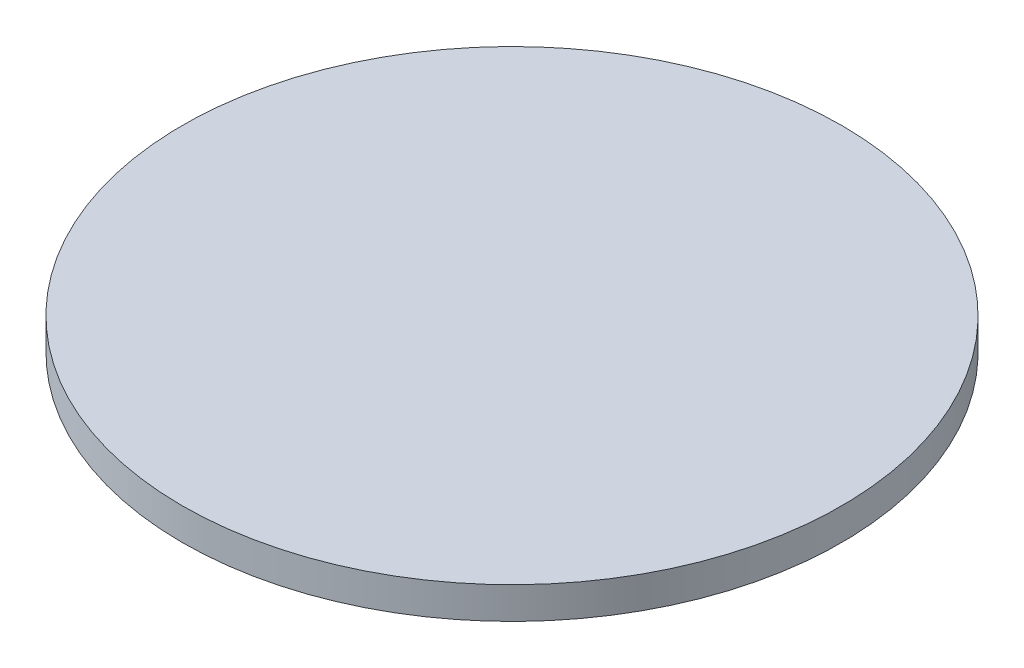
ISO-10303-21;
HEADER;
FILE_DESCRIPTION(('STEP AP214'),'2;1');
FILE_NAME('part.step','',(''),(''),'','','');
FILE_SCHEMA(('AUTOMOTIVE_DESIGN { 1 0 10303 214 1 1 1 1 }'));
ENDSEC;
DATA;
#1=APPLICATION_CONTEXT('core data for automotive mechanical design processes');
#2=APPLICATION_PROTOCOL_DEFINITION('international standard','automotive_design',2000,#1);
#3=PRODUCT_CONTEXT('',#1,'mechanical');
#4=PRODUCT('Part','Part','',(#3));
#5=PRODUCT_RELATED_PRODUCT_CATEGORY('part','',(#4));
#6=PRODUCT_DEFINITION_FORMATION('','',#4);
#7=PRODUCT_DEFINITION_CONTEXT('part definition',#1,'design');
#8=PRODUCT_DEFINITION('design','',#6,#7);
#9=PRODUCT_DEFINITION_SHAPE('','',#8);
#10=(LENGTH_UNIT() NAMED_UNIT(*) SI_UNIT(.MILLI.,.METRE.));
#11=(NAMED_UNIT(*) PLANE_ANGLE_UNIT() SI_UNIT($,.RADIAN.));
#12=(NAMED_UNIT(*) SI_UNIT($,.STERADIAN.) SOLID_ANGLE_UNIT());
#13=UNCERTAINTY_MEASURE_WITH_UNIT(LENGTH_MEASURE(1.E-05),#10,'distance_accuracy_value','');
#14=(GEOMETRIC_REPRESENTATION_CONTEXT(3) GLOBAL_UNCERTAINTY_ASSIGNED_CONTEXT((#13)) GLOBAL_UNIT_ASSIGNED_CONTEXT((#10,
#11,#12)) REPRESENTATION_CONTEXT('',''));
#15=CARTESIAN_POINT('',(0.,0.,0.));
#16=DIRECTION('',(0.,0.,1.));
#17=DIRECTION('',(1.,0.,0.));
#18=AXIS2_PLACEMENT_3D('',#15,#16,#17);
#19=CARTESIAN_POINT('',(0.,37.5,8.07840908288415));
#20=DIRECTION('',(0.,1.,0.));
#21=DIRECTION('',(0.,0.,1.));
#22=AXIS2_PLACEMENT_3D('',#19,#20,#21);
#23=PLANE('',#22);
#24=CARTESIAN_POINT('',(0.,37.5,0.));
#25=DIRECTION('',(0.,1.,0.));
#26=DIRECTION('',(-0.00319420156689542,0.,0.999994898525163));
#27=AXIS2_PLACEMENT_3D('',#24,#25,#26);
#28=CIRCLE('',#27,80.);
#29=CARTESIAN_POINT('',(-0.255536125351645,37.5,79.999591882013));
#30=VERTEX_POINT('',#29);
#31=EDGE_CURVE('E10',#30,#30,#28,.T.);
#32=ORIENTED_EDGE('',*,*,#31,.F.);
#33=EDGE_LOOP('',(#32));
#34=FACE_BOUND('',#33,.T.);
#35=ADVANCED_FACE('F30',(#34),#23,.F.);
#36=CARTESIAN_POINT('',(0.,45.2288430628446,0.));
#37=DIRECTION('',(0.,-1.,0.));
#38=DIRECTION('',(0.00319420156689542,0.,-0.999994898525163));
#39=AXIS2_PLACEMENT_3D('',#36,#37,#38);
#40=PLANE('',#39);
#41=CARTESIAN_POINT('',(0.,45.2288430628446,0.));
#42=DIRECTION('',(0.,-1.,0.));
#43=DIRECTION('',(0.00319420156689542,0.,-0.999994898525163));
#44=AXIS2_PLACEMENT_3D('',#41,#42,#43);
#45=CIRCLE('',#44,80.);
#46=CARTESIAN_POINT('',(0.255536125351622,45.2288430628446,-79.999591882013));
#47=VERTEX_POINT('',#46);
#48=EDGE_CURVE('E37',#47,#47,#45,.T.);
#49=ORIENTED_EDGE('',*,*,#48,.F.);
#50=EDGE_LOOP('',(#49));
#51=FACE_BOUND('',#50,.T.);
#52=ADVANCED_FACE('F44',(#51),#40,.F.);
#53=CARTESIAN_POINT('',(0.,-34.7711569371554,0.));
#54=DIRECTION('',(0.,-1.,0.));
#55=DIRECTION('',(0.00319420156689542,0.,-0.999994898525163));
#56=AXIS2_PLACEMENT_3D('',#53,#54,#55);
#57=CYLINDRICAL_SURFACE('',#56,80.);
#58=ORIENTED_EDGE('',*,*,#31,.T.);
#59=EDGE_LOOP('',(#58));
#60=FACE_BOUND('',#59,.T.);
#61=ORIENTED_EDGE('',*,*,#48,.T.);
#62=EDGE_LOOP('',(#61));
#63=FACE_BOUND('',#62,.T.);
#64=ADVANCED_FACE('F32',(#60,#63),#57,.T.);
#65=CLOSED_SHELL('',(#35,#52,#64));
#66=MANIFOLD_SOLID_BREP('B2',#65);
#67=ADVANCED_BREP_SHAPE_REPRESENTATION('',(#18,#66),#14);
#68=SHAPE_DEFINITION_REPRESENTATION(#9,#67);
ENDSEC;
END-ISO-10303-21;
